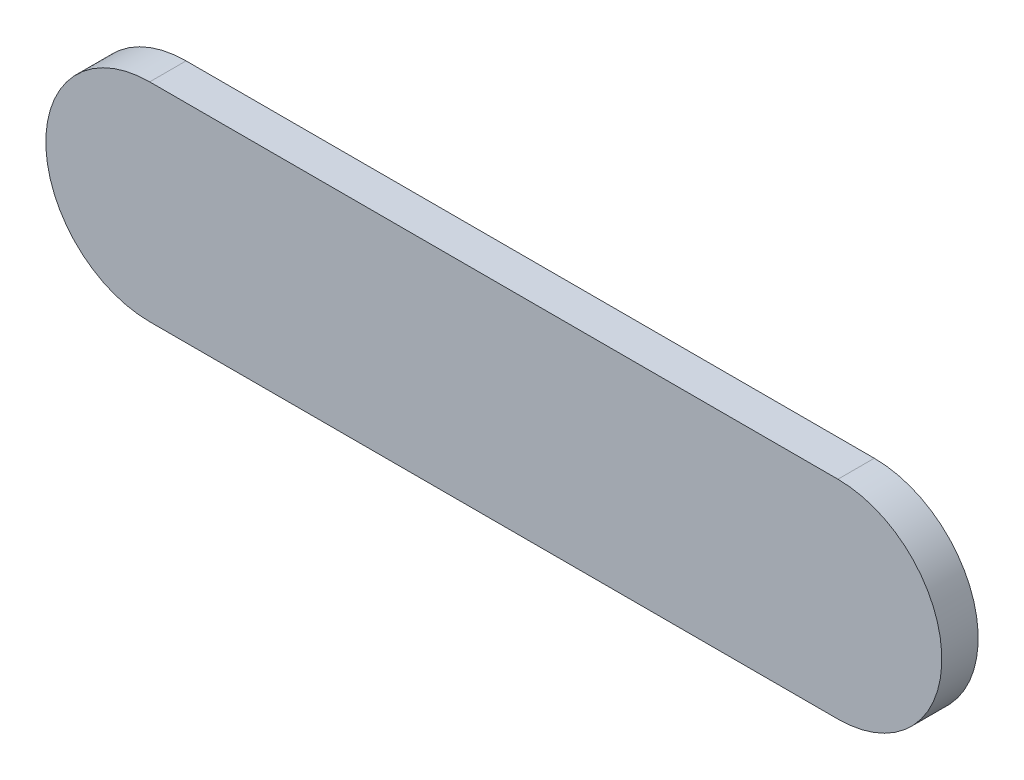
ISO-10303-21;
HEADER;
FILE_DESCRIPTION(('STEP AP214'),'2;1');
FILE_NAME('part.step','',(''),(''),'','','');
FILE_SCHEMA(('AUTOMOTIVE_DESIGN { 1 0 10303 214 1 1 1 1 }'));
ENDSEC;
DATA;
#1=APPLICATION_CONTEXT('core data for automotive mechanical design processes');
#2=APPLICATION_PROTOCOL_DEFINITION('international standard','automotive_design',2000,#1);
#3=PRODUCT_CONTEXT('',#1,'mechanical');
#4=PRODUCT('Part','Part','',(#3));
#5=PRODUCT_RELATED_PRODUCT_CATEGORY('part','',(#4));
#6=PRODUCT_DEFINITION_FORMATION('','',#4);
#7=PRODUCT_DEFINITION_CONTEXT('part definition',#1,'design');
#8=PRODUCT_DEFINITION('design','',#6,#7);
#9=PRODUCT_DEFINITION_SHAPE('','',#8);
#10=(LENGTH_UNIT() NAMED_UNIT(*) SI_UNIT(.MILLI.,.METRE.));
#11=(NAMED_UNIT(*) PLANE_ANGLE_UNIT() SI_UNIT($,.RADIAN.));
#12=(NAMED_UNIT(*) SI_UNIT($,.STERADIAN.) SOLID_ANGLE_UNIT());
#13=UNCERTAINTY_MEASURE_WITH_UNIT(LENGTH_MEASURE(1.E-05),#10,'distance_accuracy_value','');
#14=(GEOMETRIC_REPRESENTATION_CONTEXT(3) GLOBAL_UNCERTAINTY_ASSIGNED_CONTEXT((#13)) GLOBAL_UNIT_ASSIGNED_CONTEXT((#10,
#11,#12)) REPRESENTATION_CONTEXT('',''));
#15=CARTESIAN_POINT('',(0.,0.,0.));
#16=DIRECTION('',(0.,0.,1.));
#17=DIRECTION('',(1.,0.,0.));
#18=AXIS2_PLACEMENT_3D('',#15,#16,#17);
#19=CARTESIAN_POINT('',(80.85,-110.5,1.635));
#20=DIRECTION('',(0.,0.,1.));
#21=DIRECTION('',(1.,0.,0.));
#22=AXIS2_PLACEMENT_3D('',#19,#20,#21);
#23=PLANE('',#22);
#24=DIRECTION('',(1.,0.,0.));
#25=VECTOR('',#24,1.);
#26=CARTESIAN_POINT('',(80.85,-110.5,1.635));
#27=LINE('',#26,#25);
#28=CARTESIAN_POINT('',(80.85,-110.5,1.635));
#29=VERTEX_POINT('',#28);
#30=CARTESIAN_POINT('',(81.5125,-110.5,1.635));
#31=VERTEX_POINT('',#30);
#32=EDGE_CURVE('E81',#29,#31,#27,.T.);
#33=ORIENTED_EDGE('',*,*,#32,.T.);
#34=CARTESIAN_POINT('',(81.5125,-110.4,1.635));
#35=DIRECTION('',(0.,0.,1.));
#36=DIRECTION('',(1.42108547152E-13,-1.,0.));
#37=AXIS2_PLACEMENT_3D('',#34,#35,#36);
#38=CIRCLE('',#37,0.1);
#39=CARTESIAN_POINT('',(81.5125,-110.3,1.635));
#40=VERTEX_POINT('',#39);
#41=EDGE_CURVE('E79',#31,#40,#38,.T.);
#42=ORIENTED_EDGE('',*,*,#41,.T.);
#43=DIRECTION('',(-1.,0.,0.));
#44=VECTOR('',#43,1.);
#45=CARTESIAN_POINT('',(81.5125,-110.3,1.635));
#46=LINE('',#45,#44);
#47=CARTESIAN_POINT('',(80.85,-110.3,1.635));
#48=VERTEX_POINT('',#47);
#49=EDGE_CURVE('E68',#40,#48,#46,.T.);
#50=ORIENTED_EDGE('',*,*,#49,.T.);
#51=CARTESIAN_POINT('',(80.85,-110.4,1.635));
#52=DIRECTION('',(0.,0.,1.));
#53=DIRECTION('',(-1.42108547152E-13,1.,0.));
#54=AXIS2_PLACEMENT_3D('',#51,#52,#53);
#55=CIRCLE('',#54,0.1);
#56=EDGE_CURVE('E11',#48,#29,#55,.T.);
#57=ORIENTED_EDGE('',*,*,#56,.T.);
#58=EDGE_LOOP('',(#33,#42,#50,#57));
#59=FACE_BOUND('',#58,.T.);
#60=ADVANCED_FACE('F17',(#59),#23,.T.);
#61=CARTESIAN_POINT('',(80.85,-110.5,1.6));
#62=DIRECTION('',(0.,0.,1.));
#63=DIRECTION('',(1.,0.,0.));
#64=AXIS2_PLACEMENT_3D('',#61,#62,#63);
#65=PLANE('',#64);
#66=CARTESIAN_POINT('',(80.85,-110.4,1.6));
#67=DIRECTION('',(0.,0.,1.));
#68=DIRECTION('',(-1.42108547152E-13,1.,0.));
#69=AXIS2_PLACEMENT_3D('',#66,#67,#68);
#70=CIRCLE('',#69,0.1);
#71=CARTESIAN_POINT('',(80.85,-110.3,1.6));
#72=VERTEX_POINT('',#71);
#73=CARTESIAN_POINT('',(80.85,-110.5,1.6));
#74=VERTEX_POINT('',#73);
#75=EDGE_CURVE('E26',#72,#74,#70,.T.);
#76=ORIENTED_EDGE('',*,*,#75,.F.);
#77=DIRECTION('',(-1.,0.,0.));
#78=VECTOR('',#77,1.);
#79=CARTESIAN_POINT('',(81.5125,-110.3,1.6));
#80=LINE('',#79,#78);
#81=CARTESIAN_POINT('',(81.5125,-110.3,1.6));
#82=VERTEX_POINT('',#81);
#83=EDGE_CURVE('E61',#82,#72,#80,.T.);
#84=ORIENTED_EDGE('',*,*,#83,.F.);
#85=CARTESIAN_POINT('',(81.5125,-110.4,1.6));
#86=DIRECTION('',(0.,0.,1.));
#87=DIRECTION('',(1.42108547152E-13,-1.,0.));
#88=AXIS2_PLACEMENT_3D('',#85,#86,#87);
#89=CIRCLE('',#88,0.1);
#90=CARTESIAN_POINT('',(81.5125,-110.5,1.6));
#91=VERTEX_POINT('',#90);
#92=EDGE_CURVE('E88',#91,#82,#89,.T.);
#93=ORIENTED_EDGE('',*,*,#92,.F.);
#94=DIRECTION('',(1.,0.,0.));
#95=VECTOR('',#94,1.);
#96=CARTESIAN_POINT('',(80.85,-110.5,1.6));
#97=LINE('',#96,#95);
#98=EDGE_CURVE('E111',#74,#91,#97,.T.);
#99=ORIENTED_EDGE('',*,*,#98,.F.);
#100=EDGE_LOOP('',(#76,#84,#93,#99));
#101=FACE_BOUND('',#100,.T.);
#102=ADVANCED_FACE('F113',(#101),#65,.F.);
#103=CARTESIAN_POINT('',(80.85,-110.4,1.6));
#104=DIRECTION('',(0.,0.,-1.));
#105=DIRECTION('',(-1.42108547152E-13,1.,0.));
#106=AXIS2_PLACEMENT_3D('',#103,#104,#105);
#107=CYLINDRICAL_SURFACE('',#106,0.1);
#108=ORIENTED_EDGE('',*,*,#75,.T.);
#109=DIRECTION('',(0.,0.,1.));
#110=VECTOR('',#109,1.);
#111=CARTESIAN_POINT('',(80.85,-110.5,1.6));
#112=LINE('',#111,#110);
#113=EDGE_CURVE('E95',#74,#29,#112,.T.);
#114=ORIENTED_EDGE('',*,*,#113,.T.);
#115=ORIENTED_EDGE('',*,*,#56,.F.);
#116=DIRECTION('',(0.,0.,1.));
#117=VECTOR('',#116,1.);
#118=CARTESIAN_POINT('',(80.85,-110.3,1.6));
#119=LINE('',#118,#117);
#120=EDGE_CURVE('E74',#72,#48,#119,.T.);
#121=ORIENTED_EDGE('',*,*,#120,.F.);
#122=EDGE_LOOP('',(#108,#114,#115,#121));
#123=FACE_BOUND('',#122,.T.);
#124=ADVANCED_FACE('F106',(#123),#107,.T.);
#125=CARTESIAN_POINT('',(81.5125,-110.3,1.6));
#126=DIRECTION('',(0.,-1.,0.));
#127=DIRECTION('',(0.,0.,-1.));
#128=AXIS2_PLACEMENT_3D('',#125,#126,#127);
#129=PLANE('',#128);
#130=ORIENTED_EDGE('',*,*,#83,.T.);
#131=ORIENTED_EDGE('',*,*,#120,.T.);
#132=ORIENTED_EDGE('',*,*,#49,.F.);
#133=DIRECTION('',(0.,0.,1.));
#134=VECTOR('',#133,1.);
#135=CARTESIAN_POINT('',(81.5125,-110.3,1.6));
#136=LINE('',#135,#134);
#137=EDGE_CURVE('E72',#82,#40,#136,.T.);
#138=ORIENTED_EDGE('',*,*,#137,.F.);
#139=EDGE_LOOP('',(#130,#131,#132,#138));
#140=FACE_BOUND('',#139,.T.);
#141=ADVANCED_FACE('F70',(#140),#129,.F.);
#142=CARTESIAN_POINT('',(81.5125,-110.4,1.6));
#143=DIRECTION('',(0.,0.,-1.));
#144=DIRECTION('',(1.42108547152E-13,-1.,0.));
#145=AXIS2_PLACEMENT_3D('',#142,#143,#144);
#146=CYLINDRICAL_SURFACE('',#145,0.1);
#147=ORIENTED_EDGE('',*,*,#92,.T.);
#148=ORIENTED_EDGE('',*,*,#137,.T.);
#149=ORIENTED_EDGE('',*,*,#41,.F.);
#150=DIRECTION('',(0.,0.,1.));
#151=VECTOR('',#150,1.);
#152=CARTESIAN_POINT('',(81.5125,-110.5,1.6));
#153=LINE('',#152,#151);
#154=EDGE_CURVE('E115',#91,#31,#153,.T.);
#155=ORIENTED_EDGE('',*,*,#154,.F.);
#156=EDGE_LOOP('',(#147,#148,#149,#155));
#157=FACE_BOUND('',#156,.T.);
#158=ADVANCED_FACE('F87',(#157),#146,.T.);
#159=CARTESIAN_POINT('',(80.85,-110.5,1.6));
#160=DIRECTION('',(0.,1.,0.));
#161=DIRECTION('',(1.,0.,0.));
#162=AXIS2_PLACEMENT_3D('',#159,#160,#161);
#163=PLANE('',#162);
#164=ORIENTED_EDGE('',*,*,#98,.T.);
#165=ORIENTED_EDGE('',*,*,#154,.T.);
#166=ORIENTED_EDGE('',*,*,#32,.F.);
#167=ORIENTED_EDGE('',*,*,#113,.F.);
#168=EDGE_LOOP('',(#164,#165,#166,#167));
#169=FACE_BOUND('',#168,.T.);
#170=ADVANCED_FACE('F110',(#169),#163,.F.);
#171=CLOSED_SHELL('',(#60,#102,#124,#141,#158,#170));
#172=MANIFOLD_SOLID_BREP('B1',#171);
#173=ADVANCED_BREP_SHAPE_REPRESENTATION('',(#18,#172),#14);
#174=SHAPE_DEFINITION_REPRESENTATION(#9,#173);
ENDSEC;
END-ISO-10303-21;
